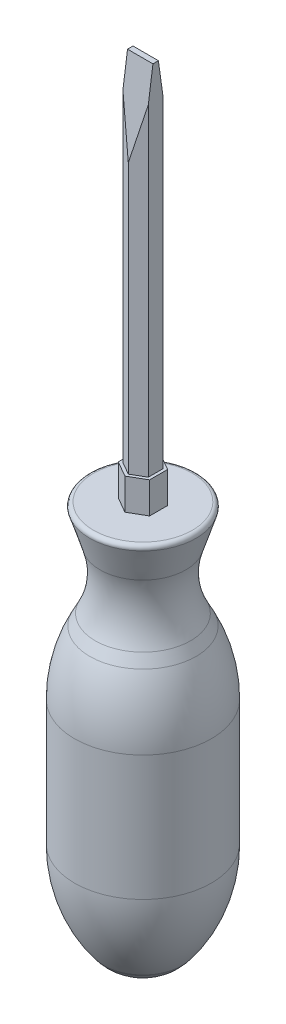
ISO-10303-21;
HEADER;
FILE_DESCRIPTION(('STEP AP214'),'2;1');
FILE_NAME('part.step','',(''),(''),'','','');
FILE_SCHEMA(('AUTOMOTIVE_DESIGN { 1 0 10303 214 1 1 1 1 }'));
ENDSEC;
DATA;
#1=APPLICATION_CONTEXT('core data for automotive mechanical design processes');
#2=APPLICATION_PROTOCOL_DEFINITION('international standard','automotive_design',2000,#1);
#3=PRODUCT_CONTEXT('',#1,'mechanical');
#4=PRODUCT('Part','Part','',(#3));
#5=PRODUCT_RELATED_PRODUCT_CATEGORY('part','',(#4));
#6=PRODUCT_DEFINITION_FORMATION('','',#4);
#7=PRODUCT_DEFINITION_CONTEXT('part definition',#1,'design');
#8=PRODUCT_DEFINITION('design','',#6,#7);
#9=PRODUCT_DEFINITION_SHAPE('','',#8);
#10=(LENGTH_UNIT() NAMED_UNIT(*) SI_UNIT(.MILLI.,.METRE.));
#11=(NAMED_UNIT(*) PLANE_ANGLE_UNIT() SI_UNIT($,.RADIAN.));
#12=(NAMED_UNIT(*) SI_UNIT($,.STERADIAN.) SOLID_ANGLE_UNIT());
#13=UNCERTAINTY_MEASURE_WITH_UNIT(LENGTH_MEASURE(1.E-05),#10,'distance_accuracy_value','');
#14=(GEOMETRIC_REPRESENTATION_CONTEXT(3) GLOBAL_UNCERTAINTY_ASSIGNED_CONTEXT((#13)) GLOBAL_UNIT_ASSIGNED_CONTEXT((#10,
#11,#12)) REPRESENTATION_CONTEXT('',''));
#15=CARTESIAN_POINT('',(0.,0.,0.));
#16=DIRECTION('',(0.,0.,1.));
#17=DIRECTION('',(1.,0.,0.));
#18=AXIS2_PLACEMENT_3D('',#15,#16,#17);
#19=CARTESIAN_POINT('',(-3.25,99.,-1.87638837486629));
#20=DIRECTION('',(1.,0.,0.));
#21=DIRECTION('',(0.,0.,-1.));
#22=AXIS2_PLACEMENT_3D('',#19,#20,#21);
#23=PLANE('',#22);
#24=DIRECTION('',(0.,-0.99050931319309,0.137445627350429));
#25=VECTOR('',#24,1.);
#26=CARTESIAN_POINT('',(-3.25,99.350752537901,0.65132867306301));
#27=LINE('',#26,#25);
#28=CARTESIAN_POINT('',(-3.25,99.,0.699999999999999));
#29=VERTEX_POINT('',#28);
#30=CARTESIAN_POINT('',(-3.25,90.5222938430314,1.87638837486628));
#31=VERTEX_POINT('',#30);
#32=EDGE_CURVE('E140',#29,#31,#27,.T.);
#33=ORIENTED_EDGE('',*,*,#32,.F.);
#34=DIRECTION('',(0.,0.,1.));
#35=VECTOR('',#34,1.);
#36=CARTESIAN_POINT('',(-3.25,99.,-1.87638837486629));
#37=LINE('',#36,#35);
#38=CARTESIAN_POINT('',(-3.25,99.,-0.700000000000001));
#39=VERTEX_POINT('',#38);
#40=EDGE_CURVE('E257',#39,#29,#37,.T.);
#41=ORIENTED_EDGE('',*,*,#40,.F.);
#42=DIRECTION('',(0.,-0.99050931319309,-0.137445627350429));
#43=VECTOR('',#42,1.);
#44=CARTESIAN_POINT('',(-3.25,98.8398451056266,-0.722223506268136));
#45=LINE('',#44,#43);
#46=CARTESIAN_POINT('',(-3.25,90.5222938430314,-1.87638837486629));
#47=VERTEX_POINT('',#46);
#48=EDGE_CURVE('E58',#39,#47,#45,.T.);
#49=ORIENTED_EDGE('',*,*,#48,.T.);
#50=DIRECTION('',(0.,-1.,0.));
#51=VECTOR('',#50,1.);
#52=CARTESIAN_POINT('',(-3.25,99.,-1.87638837486629));
#53=LINE('',#52,#51);
#54=CARTESIAN_POINT('',(-3.25,8.,-1.87638837486629));
#55=VERTEX_POINT('',#54);
#56=EDGE_CURVE('E261',#47,#55,#53,.T.);
#57=ORIENTED_EDGE('',*,*,#56,.T.);
#58=DIRECTION('',(0.,0.,1.));
#59=VECTOR('',#58,1.);
#60=CARTESIAN_POINT('',(-3.25,8.,-1.87638837486629));
#61=LINE('',#60,#59);
#62=CARTESIAN_POINT('',(-3.25,8.,1.87638837486628));
#63=VERTEX_POINT('',#62);
#64=EDGE_CURVE('E251',#55,#63,#61,.T.);
#65=ORIENTED_EDGE('',*,*,#64,.T.);
#66=DIRECTION('',(0.,-1.,0.));
#67=VECTOR('',#66,1.);
#68=CARTESIAN_POINT('',(-3.25,99.,1.87638837486628));
#69=LINE('',#68,#67);
#70=EDGE_CURVE('E157',#31,#63,#69,.T.);
#71=ORIENTED_EDGE('',*,*,#70,.F.);
#72=EDGE_LOOP('',(#33,#41,#49,#57,#65,#71));
#73=FACE_BOUND('',#72,.T.);
#74=ADVANCED_FACE('F36',(#73),#23,.F.);
#75=CARTESIAN_POINT('',(-3.25,99.,1.87638837486628));
#76=DIRECTION('',(0.5,0.,-0.866025403784438));
#77=DIRECTION('',(-0.866025403784439,0.,-0.5));
#78=AXIS2_PLACEMENT_3D('',#75,#76,#77);
#79=PLANE('',#78);
#80=DIRECTION('',(0.231590672982891,-0.963580655809246,0.133708937388479));
#81=VECTOR('',#80,1.);
#82=CARTESIAN_POINT('',(-5.14185347533571,98.3937395665544,0.784126261613883));
#83=LINE('',#82,#81);
#84=CARTESIAN_POINT('',(0.,77.,3.75277674973257));
#85=VERTEX_POINT('',#84);
#86=EDGE_CURVE('E135',#31,#85,#83,.T.);
#87=ORIENTED_EDGE('',*,*,#86,.F.);
#88=ORIENTED_EDGE('',*,*,#70,.T.);
#89=DIRECTION('',(0.866025403784438,0.,0.5));
#90=VECTOR('',#89,1.);
#91=CARTESIAN_POINT('',(-3.25,8.,1.87638837486628));
#92=LINE('',#91,#90);
#93=CARTESIAN_POINT('',(0.,8.,3.75277674973257));
#94=VERTEX_POINT('',#93);
#95=EDGE_CURVE('E155',#63,#94,#92,.T.);
#96=ORIENTED_EDGE('',*,*,#95,.T.);
#97=DIRECTION('',(0.,-1.,0.));
#98=VECTOR('',#97,1.);
#99=CARTESIAN_POINT('',(0.,99.,3.75277674973257));
#100=LINE('',#99,#98);
#101=EDGE_CURVE('E149',#85,#94,#100,.T.);
#102=ORIENTED_EDGE('',*,*,#101,.F.);
#103=EDGE_LOOP('',(#87,#88,#96,#102));
#104=FACE_BOUND('',#103,.T.);
#105=ADVANCED_FACE('F153',(#104),#79,.F.);
#106=CARTESIAN_POINT('',(0.,99.,3.75277674973257));
#107=DIRECTION('',(-0.5,0.,-0.866025403784439));
#108=DIRECTION('',(-0.866025403784439,0.,0.5));
#109=AXIS2_PLACEMENT_3D('',#106,#107,#108);
#110=PLANE('',#109);
#111=DIRECTION('',(0.231590672982891,0.963580655809245,-0.133708937388479));
#112=VECTOR('',#111,1.);
#113=CARTESIAN_POINT('',(4.90943843614749,97.4267289654951,0.918311147052926));
#114=LINE('',#113,#112);
#115=CARTESIAN_POINT('',(3.25,90.5222938430314,1.87638837486629));
#116=VERTEX_POINT('',#115);
#117=EDGE_CURVE('E138',#85,#116,#114,.T.);
#118=ORIENTED_EDGE('',*,*,#117,.F.);
#119=ORIENTED_EDGE('',*,*,#101,.T.);
#120=DIRECTION('',(0.866025403784439,0.,-0.5));
#121=VECTOR('',#120,1.);
#122=CARTESIAN_POINT('',(0.,8.,3.75277674973257));
#123=LINE('',#122,#121);
#124=CARTESIAN_POINT('',(3.25,8.,1.87638837486629));
#125=VERTEX_POINT('',#124);
#126=EDGE_CURVE('E265',#94,#125,#123,.T.);
#127=ORIENTED_EDGE('',*,*,#126,.T.);
#128=DIRECTION('',(0.,-1.,0.));
#129=VECTOR('',#128,1.);
#130=CARTESIAN_POINT('',(3.25,99.,1.87638837486629));
#131=LINE('',#130,#129);
#132=EDGE_CURVE('E151',#116,#125,#131,.T.);
#133=ORIENTED_EDGE('',*,*,#132,.F.);
#134=EDGE_LOOP('',(#118,#119,#127,#133));
#135=FACE_BOUND('',#134,.T.);
#136=ADVANCED_FACE('F147',(#135),#110,.F.);
#137=CARTESIAN_POINT('',(3.25,99.,1.87638837486629));
#138=DIRECTION('',(-1.,0.,0.));
#139=DIRECTION('',(0.,0.,1.));
#140=AXIS2_PLACEMENT_3D('',#137,#138,#139);
#141=PLANE('',#140);
#142=DIRECTION('',(0.,0.99050931319309,-0.137445627350429));
#143=VECTOR('',#142,1.);
#144=CARTESIAN_POINT('',(3.25,98.8398451056266,0.722223506268134));
#145=LINE('',#144,#143);
#146=CARTESIAN_POINT('',(3.25,99.,0.699999999999999));
#147=VERTEX_POINT('',#146);
#148=EDGE_CURVE('E51',#116,#147,#145,.T.);
#149=ORIENTED_EDGE('',*,*,#148,.F.);
#150=ORIENTED_EDGE('',*,*,#132,.T.);
#151=DIRECTION('',(0.,0.,-1.));
#152=VECTOR('',#151,1.);
#153=CARTESIAN_POINT('',(3.25,8.,1.87638837486629));
#154=LINE('',#153,#152);
#155=CARTESIAN_POINT('',(3.25,8.,-1.87638837486628));
#156=VERTEX_POINT('',#155);
#157=EDGE_CURVE('E267',#125,#156,#154,.T.);
#158=ORIENTED_EDGE('',*,*,#157,.T.);
#159=DIRECTION('',(0.,-1.,0.));
#160=VECTOR('',#159,1.);
#161=CARTESIAN_POINT('',(3.25,99.,-1.87638837486628));
#162=LINE('',#161,#160);
#163=CARTESIAN_POINT('',(3.25,90.5222938430315,-1.87638837486628));
#164=VERTEX_POINT('',#163);
#165=EDGE_CURVE('E161',#164,#156,#162,.T.);
#166=ORIENTED_EDGE('',*,*,#165,.F.);
#167=DIRECTION('',(0.,0.99050931319309,0.137445627350429));
#168=VECTOR('',#167,1.);
#169=CARTESIAN_POINT('',(3.25,99.350752537901,-0.651328673063012));
#170=LINE('',#169,#168);
#171=CARTESIAN_POINT('',(3.25,99.,-0.700000000000001));
#172=VERTEX_POINT('',#171);
#173=EDGE_CURVE('E238',#164,#172,#170,.T.);
#174=ORIENTED_EDGE('',*,*,#173,.T.);
#175=DIRECTION('',(0.,0.,-1.));
#176=VECTOR('',#175,1.);
#177=CARTESIAN_POINT('',(3.25,99.,1.87638837486629));
#178=LINE('',#177,#176);
#179=EDGE_CURVE('E247',#147,#172,#178,.T.);
#180=ORIENTED_EDGE('',*,*,#179,.F.);
#181=EDGE_LOOP('',(#149,#150,#158,#166,#174,#180));
#182=FACE_BOUND('',#181,.T.);
#183=ADVANCED_FACE('F246',(#182),#141,.F.);
#184=CARTESIAN_POINT('',(0.,99.,0.));
#185=DIRECTION('',(0.,1.,0.));
#186=DIRECTION('',(0.,0.,1.));
#187=AXIS2_PLACEMENT_3D('',#184,#185,#186);
#188=PLANE('',#187);
#189=ORIENTED_EDGE('',*,*,#40,.T.);
#190=DIRECTION('',(1.,0.,0.));
#191=VECTOR('',#190,1.);
#192=CARTESIAN_POINT('',(0.,99.,0.699999999999999));
#193=LINE('',#192,#191);
#194=EDGE_CURVE('E11',#29,#147,#193,.T.);
#195=ORIENTED_EDGE('',*,*,#194,.T.);
#196=ORIENTED_EDGE('',*,*,#179,.T.);
#197=DIRECTION('',(1.,0.,0.));
#198=VECTOR('',#197,1.);
#199=CARTESIAN_POINT('',(0.,99.,-0.700000000000001));
#200=LINE('',#199,#198);
#201=EDGE_CURVE('E44',#39,#172,#200,.T.);
#202=ORIENTED_EDGE('',*,*,#201,.F.);
#203=EDGE_LOOP('',(#189,#195,#196,#202));
#204=FACE_BOUND('',#203,.T.);
#205=ADVANCED_FACE('F292',(#204),#188,.T.);
#206=CARTESIAN_POINT('',(0.,8.,0.));
#207=DIRECTION('',(0.,1.,0.));
#208=DIRECTION('',(0.,0.,1.));
#209=AXIS2_PLACEMENT_3D('',#206,#207,#208);
#210=PLANE('',#209);
#211=DIRECTION('',(0.,0.,1.));
#212=VECTOR('',#211,1.);
#213=CARTESIAN_POINT('',(-4.,8.,-2.30940107675851));
#214=LINE('',#213,#212);
#215=CARTESIAN_POINT('',(-4.,8.,-2.30940107675851));
#216=VERTEX_POINT('',#215);
#217=CARTESIAN_POINT('',(-4.,8.,2.3094010767585));
#218=VERTEX_POINT('',#217);
#219=EDGE_CURVE('E165',#216,#218,#214,.T.);
#220=ORIENTED_EDGE('',*,*,#219,.T.);
#221=DIRECTION('',(0.866025403784438,0.,0.5));
#222=VECTOR('',#221,1.);
#223=CARTESIAN_POINT('',(-4.,8.,2.3094010767585));
#224=LINE('',#223,#222);
#225=CARTESIAN_POINT('',(0.,8.,4.61880215351701));
#226=VERTEX_POINT('',#225);
#227=EDGE_CURVE('E168',#218,#226,#224,.T.);
#228=ORIENTED_EDGE('',*,*,#227,.T.);
#229=DIRECTION('',(0.866025403784439,0.,-0.499999999999999));
#230=VECTOR('',#229,1.);
#231=CARTESIAN_POINT('',(0.,8.,4.61880215351701));
#232=LINE('',#231,#230);
#233=CARTESIAN_POINT('',(4.,8.,2.30940107675851));
#234=VERTEX_POINT('',#233);
#235=EDGE_CURVE('E171',#226,#234,#232,.T.);
#236=ORIENTED_EDGE('',*,*,#235,.T.);
#237=DIRECTION('',(0.,0.,-1.));
#238=VECTOR('',#237,1.);
#239=CARTESIAN_POINT('',(4.,8.,2.30940107675851));
#240=LINE('',#239,#238);
#241=CARTESIAN_POINT('',(4.,8.,-2.3094010767585));
#242=VERTEX_POINT('',#241);
#243=EDGE_CURVE('E173',#234,#242,#240,.T.);
#244=ORIENTED_EDGE('',*,*,#243,.T.);
#245=DIRECTION('',(-0.866025403784438,0.,-0.5));
#246=VECTOR('',#245,1.);
#247=CARTESIAN_POINT('',(4.,8.,-2.3094010767585));
#248=LINE('',#247,#246);
#249=CARTESIAN_POINT('',(0.,8.,-4.61880215351701));
#250=VERTEX_POINT('',#249);
#251=EDGE_CURVE('E175',#242,#250,#248,.T.);
#252=ORIENTED_EDGE('',*,*,#251,.T.);
#253=DIRECTION('',(-0.866025403784439,0.,0.499999999999999));
#254=VECTOR('',#253,1.);
#255=CARTESIAN_POINT('',(0.,8.,-4.61880215351701));
#256=LINE('',#255,#254);
#257=EDGE_CURVE('E177',#250,#216,#256,.T.);
#258=ORIENTED_EDGE('',*,*,#257,.T.);
#259=EDGE_LOOP('',(#220,#228,#236,#244,#252,#258));
#260=FACE_BOUND('',#259,.T.);
#261=ORIENTED_EDGE('',*,*,#95,.F.);
#262=ORIENTED_EDGE('',*,*,#64,.F.);
#263=DIRECTION('',(-0.866025403784439,0.,0.5));
#264=VECTOR('',#263,1.);
#265=CARTESIAN_POINT('',(0.,8.,-3.75277674973257));
#266=LINE('',#265,#264);
#267=CARTESIAN_POINT('',(0.,8.,-3.75277674973257));
#268=VERTEX_POINT('',#267);
#269=EDGE_CURVE('E259',#268,#55,#266,.T.);
#270=ORIENTED_EDGE('',*,*,#269,.F.);
#271=DIRECTION('',(-0.866025403784438,0.,-0.5));
#272=VECTOR('',#271,1.);
#273=CARTESIAN_POINT('',(3.25,8.,-1.87638837486628));
#274=LINE('',#273,#272);
#275=EDGE_CURVE('E269',#156,#268,#274,.T.);
#276=ORIENTED_EDGE('',*,*,#275,.F.);
#277=ORIENTED_EDGE('',*,*,#157,.F.);
#278=ORIENTED_EDGE('',*,*,#126,.F.);
#279=EDGE_LOOP('',(#261,#262,#270,#276,#277,#278));
#280=FACE_BOUND('',#279,.T.);
#281=ADVANCED_FACE('F283',(#260,#280),#210,.T.);
#282=CARTESIAN_POINT('',(-12.6496969405464,0.,0.));
#283=DIRECTION('',(0.,1.,0.));
#284=DIRECTION('',(0.,0.,1.));
#285=AXIS2_PLACEMENT_3D('',#282,#283,#284);
#286=PLANE('',#285);
#287=CARTESIAN_POINT('',(0.,0.,0.));
#288=DIRECTION('',(0.,1.,0.));
#289=DIRECTION('',(0.,0.,1.));
#290=AXIS2_PLACEMENT_3D('',#287,#288,#289);
#291=CIRCLE('',#290,12.6496969405464);
#292=CARTESIAN_POINT('',(0.,0.,12.6496969405464));
#293=VERTEX_POINT('',#292);
#294=EDGE_CURVE('E231',#293,#293,#291,.T.);
#295=ORIENTED_EDGE('',*,*,#294,.T.);
#296=EDGE_LOOP('',(#295));
#297=FACE_BOUND('',#296,.T.);
#298=DIRECTION('',(0.866025403784438,0.,0.5));
#299=VECTOR('',#298,1.);
#300=CARTESIAN_POINT('',(-4.,0.,2.3094010767585));
#301=LINE('',#300,#299);
#302=CARTESIAN_POINT('',(-4.,0.,2.3094010767585));
#303=VERTEX_POINT('',#302);
#304=CARTESIAN_POINT('',(0.,0.,4.61880215351701));
#305=VERTEX_POINT('',#304);
#306=EDGE_CURVE('E182',#303,#305,#301,.T.);
#307=ORIENTED_EDGE('',*,*,#306,.F.);
#308=DIRECTION('',(0.,0.,1.));
#309=VECTOR('',#308,1.);
#310=CARTESIAN_POINT('',(-4.,0.,-2.30940107675851));
#311=LINE('',#310,#309);
#312=CARTESIAN_POINT('',(-4.,0.,-2.30940107675851));
#313=VERTEX_POINT('',#312);
#314=EDGE_CURVE('E159',#313,#303,#311,.T.);
#315=ORIENTED_EDGE('',*,*,#314,.F.);
#316=DIRECTION('',(-0.866025403784439,0.,0.499999999999999));
#317=VECTOR('',#316,1.);
#318=CARTESIAN_POINT('',(0.,0.,-4.61880215351701));
#319=LINE('',#318,#317);
#320=CARTESIAN_POINT('',(0.,0.,-4.61880215351701));
#321=VERTEX_POINT('',#320);
#322=EDGE_CURVE('E169',#321,#313,#319,.T.);
#323=ORIENTED_EDGE('',*,*,#322,.F.);
#324=DIRECTION('',(-0.866025403784438,0.,-0.5));
#325=VECTOR('',#324,1.);
#326=CARTESIAN_POINT('',(4.,0.,-2.3094010767585));
#327=LINE('',#326,#325);
#328=CARTESIAN_POINT('',(4.,0.,-2.3094010767585));
#329=VERTEX_POINT('',#328);
#330=EDGE_CURVE('E188',#329,#321,#327,.T.);
#331=ORIENTED_EDGE('',*,*,#330,.F.);
#332=DIRECTION('',(0.,0.,-1.));
#333=VECTOR('',#332,1.);
#334=CARTESIAN_POINT('',(4.,0.,2.30940107675851));
#335=LINE('',#334,#333);
#336=CARTESIAN_POINT('',(4.,0.,2.30940107675851));
#337=VERTEX_POINT('',#336);
#338=EDGE_CURVE('E186',#337,#329,#335,.T.);
#339=ORIENTED_EDGE('',*,*,#338,.F.);
#340=DIRECTION('',(0.866025403784439,0.,-0.499999999999999));
#341=VECTOR('',#340,1.);
#342=CARTESIAN_POINT('',(0.,0.,4.61880215351701));
#343=LINE('',#342,#341);
#344=EDGE_CURVE('E184',#305,#337,#343,.T.);
#345=ORIENTED_EDGE('',*,*,#344,.F.);
#346=EDGE_LOOP('',(#307,#315,#323,#331,#339,#345));
#347=FACE_BOUND('',#346,.T.);
#348=ADVANCED_FACE('F299',(#297,#347),#286,.T.);
#349=CARTESIAN_POINT('',(0.,-92.,0.));
#350=DIRECTION('',(0.,1.,0.));
#351=DIRECTION('',(0.,0.,1.));
#352=AXIS2_PLACEMENT_3D('',#349,#350,#351);
#353=DEGENERATE_TOROIDAL_SURFACE('',#352,1.80659044005612,10.,.T.);
#354=CARTESIAN_POINT('',(0.,-102.,0.));
#355=DIRECTION('',(0.,1.,0.));
#356=DIRECTION('',(0.,0.,1.));
#357=AXIS2_PLACEMENT_3D('',#354,#355,#356);
#358=CIRCLE('',#357,1.80659044005612);
#359=CARTESIAN_POINT('',(0.,-102.,1.80659044005612));
#360=VERTEX_POINT('',#359);
#361=EDGE_CURVE('E234',#360,#360,#358,.T.);
#362=ORIENTED_EDGE('',*,*,#361,.T.);
#363=EDGE_LOOP('',(#362));
#364=FACE_BOUND('',#363,.T.);
#365=CARTESIAN_POINT('',(0.,-98.1339305177818,0.));
#366=DIRECTION('',(0.,1.,0.));
#367=DIRECTION('',(0.,0.,1.));
#368=AXIS2_PLACEMENT_3D('',#365,#366,#367);
#369=CIRCLE('',#368,9.70436838090914);
#370=CARTESIAN_POINT('',(0.,-98.1339305177818,9.70436838090914));
#371=VERTEX_POINT('',#370);
#372=EDGE_CURVE('E207',#371,#371,#369,.T.);
#373=ORIENTED_EDGE('',*,*,#372,.F.);
#374=EDGE_LOOP('',(#373));
#375=FACE_BOUND('',#374,.T.);
#376=ADVANCED_FACE('F38',(#364,#375),#353,.T.);
#377=CARTESIAN_POINT('',(-1.80659044005612,-102.,0.));
#378=DIRECTION('',(0.,-1.,0.));
#379=DIRECTION('',(0.,0.,-1.));
#380=AXIS2_PLACEMENT_3D('',#377,#378,#379);
#381=PLANE('',#380);
#382=ORIENTED_EDGE('',*,*,#361,.F.);
#383=EDGE_LOOP('',(#382));
#384=FACE_BOUND('',#383,.T.);
#385=ADVANCED_FACE('F368',(#384),#381,.T.);
#386=CARTESIAN_POINT('',(0.,-1.,0.));
#387=DIRECTION('',(0.,1.,0.));
#388=DIRECTION('',(0.,0.,1.));
#389=AXIS2_PLACEMENT_3D('',#386,#387,#388);
#390=TOROIDAL_SURFACE('',#389,12.6496969405464,1.);
#391=CARTESIAN_POINT('',(0.,-1.30201949241902,0.));
#392=DIRECTION('',(0.,1.,0.));
#393=DIRECTION('',(0.,0.,1.));
#394=AXIS2_PLACEMENT_3D('',#391,#392,#393);
#395=CIRCLE('',#394,13.6029986903607);
#396=CARTESIAN_POINT('',(0.,-1.30201949241902,13.6029986903607));
#397=VERTEX_POINT('',#396);
#398=EDGE_CURVE('E228',#397,#397,#395,.T.);
#399=ORIENTED_EDGE('',*,*,#398,.T.);
#400=EDGE_LOOP('',(#399));
#401=FACE_BOUND('',#400,.T.);
#402=ORIENTED_EDGE('',*,*,#294,.F.);
#403=EDGE_LOOP('',(#402));
#404=FACE_BOUND('',#403,.T.);
#405=ADVANCED_FACE('F364',(#401,#404),#390,.T.);
#406=CARTESIAN_POINT('',(0.,-1.30201949241902,0.));
#407=DIRECTION('',(0.,1.,0.));
#408=DIRECTION('',(0.,0.,1.));
#409=AXIS2_PLACEMENT_3D('',#406,#407,#408);
#410=CONICAL_SURFACE('',#409,13.6029986903607,0.306810364064564);
#411=CARTESIAN_POINT('',(0.,-9.62037889169504,0.));
#412=DIRECTION('',(0.,1.,0.));
#413=DIRECTION('',(0.,0.,1.));
#414=AXIS2_PLACEMENT_3D('',#411,#412,#413);
#415=CIRCLE('',#414,10.9676246505901);
#416=CARTESIAN_POINT('',(0.,-9.62037889169504,10.9676246505901));
#417=VERTEX_POINT('',#416);
#418=EDGE_CURVE('E225',#417,#417,#415,.T.);
#419=ORIENTED_EDGE('',*,*,#418,.T.);
#420=EDGE_LOOP('',(#419));
#421=FACE_BOUND('',#420,.T.);
#422=ORIENTED_EDGE('',*,*,#398,.F.);
#423=EDGE_LOOP('',(#422));
#424=FACE_BOUND('',#423,.T.);
#425=ADVANCED_FACE('F360',(#421,#424),#410,.T.);
#426=CARTESIAN_POINT('',(0.,-15.6607687400758,0.));
#427=DIRECTION('',(0.,1.,0.));
#428=DIRECTION('',(0.,0.,1.));
#429=AXIS2_PLACEMENT_3D('',#426,#427,#428);
#430=TOROIDAL_SURFACE('',#429,30.0336596468754,20.);
#431=CARTESIAN_POINT('',(0.,-24.7113378355905,0.));
#432=DIRECTION('',(0.,1.,0.));
#433=DIRECTION('',(0.,0.,1.));
#434=AXIS2_PLACEMENT_3D('',#431,#432,#433);
#435=CIRCLE('',#434,12.1986603744529);
#436=CARTESIAN_POINT('',(0.,-24.7113378355905,12.1986603744529));
#437=VERTEX_POINT('',#436);
#438=EDGE_CURVE('E222',#437,#437,#435,.T.);
#439=ORIENTED_EDGE('',*,*,#438,.T.);
#440=EDGE_LOOP('',(#439));
#441=FACE_BOUND('',#440,.T.);
#442=ORIENTED_EDGE('',*,*,#418,.F.);
#443=EDGE_LOOP('',(#442));
#444=FACE_BOUND('',#443,.T.);
#445=ADVANCED_FACE('F356',(#441,#444),#430,.F.);
#446=CARTESIAN_POINT('',(0.,-24.7113378355905,0.));
#447=DIRECTION('',(0.,-1.,0.));
#448=DIRECTION('',(0.,0.,-1.));
#449=AXIS2_PLACEMENT_3D('',#446,#447,#448);
#450=CONICAL_SURFACE('',#449,12.1986603744529,0.469598691262018);
#451=CARTESIAN_POINT('',(0.,-27.4787188232526,0.));
#452=DIRECTION('',(0.,1.,0.));
#453=DIRECTION('',(0.,0.,1.));
#454=AXIS2_PLACEMENT_3D('',#451,#452,#453);
#455=CIRCLE('',#454,13.6029986903606);
#456=CARTESIAN_POINT('',(0.,-27.4787188232526,13.6029986903606));
#457=VERTEX_POINT('',#456);
#458=EDGE_CURVE('E219',#457,#457,#455,.T.);
#459=ORIENTED_EDGE('',*,*,#458,.T.);
#460=EDGE_LOOP('',(#459));
#461=FACE_BOUND('',#460,.T.);
#462=ORIENTED_EDGE('',*,*,#438,.F.);
#463=EDGE_LOOP('',(#462));
#464=FACE_BOUND('',#463,.T.);
#465=ADVANCED_FACE('F352',(#461,#464),#450,.T.);
#466=CARTESIAN_POINT('',(0.,-43.7697431951792,0.));
#467=DIRECTION('',(0.,1.,0.));
#468=DIRECTION('',(0.,0.,1.));
#469=AXIS2_PLACEMENT_3D('',#466,#467,#468);
#470=DEGENERATE_TOROIDAL_SURFACE('',#469,18.5,36.,.F.);
#471=CARTESIAN_POINT('',(0.,-43.7697431951792,0.));
#472=DIRECTION('',(0.,1.,0.));
#473=DIRECTION('',(0.,0.,1.));
#474=AXIS2_PLACEMENT_3D('',#471,#472,#473);
#475=CIRCLE('',#474,17.5);
#476=CARTESIAN_POINT('',(0.,-43.7697431951792,17.5));
#477=VERTEX_POINT('',#476);
#478=EDGE_CURVE('E216',#477,#477,#475,.T.);
#479=ORIENTED_EDGE('',*,*,#478,.T.);
#480=EDGE_LOOP('',(#479));
#481=FACE_BOUND('',#480,.T.);
#482=ORIENTED_EDGE('',*,*,#458,.F.);
#483=EDGE_LOOP('',(#482));
#484=FACE_BOUND('',#483,.T.);
#485=ADVANCED_FACE('F348',(#481,#484),#470,.F.);
#486=CARTESIAN_POINT('',(0.,79.6261522890065,0.));
#487=DIRECTION('',(0.,1.,0.));
#488=DIRECTION('',(0.,0.,1.));
#489=AXIS2_PLACEMENT_3D('',#486,#487,#488);
#490=CYLINDRICAL_SURFACE('',#489,17.5);
#491=CARTESIAN_POINT('',(0.,-75.7586914817852,0.));
#492=DIRECTION('',(0.,1.,0.));
#493=DIRECTION('',(0.,0.,1.));
#494=AXIS2_PLACEMENT_3D('',#491,#492,#493);
#495=CIRCLE('',#494,17.5);
#496=CARTESIAN_POINT('',(0.,-75.7586914817852,17.5));
#497=VERTEX_POINT('',#496);
#498=EDGE_CURVE('E213',#497,#497,#495,.T.);
#499=ORIENTED_EDGE('',*,*,#498,.T.);
#500=EDGE_LOOP('',(#499));
#501=FACE_BOUND('',#500,.T.);
#502=ORIENTED_EDGE('',*,*,#478,.F.);
#503=EDGE_LOOP('',(#502));
#504=FACE_BOUND('',#503,.T.);
#505=ADVANCED_FACE('F344',(#501,#504),#490,.T.);
#506=CARTESIAN_POINT('',(0.,-75.7586914817852,0.));
#507=DIRECTION('',(0.,1.,0.));
#508=DIRECTION('',(0.,0.,1.));
#509=AXIS2_PLACEMENT_3D('',#506,#507,#508);
#510=DEGENERATE_TOROIDAL_SURFACE('',#509,18.5,36.,.F.);
#511=CARTESIAN_POINT('',(0.,-97.8408413457998,0.));
#512=DIRECTION('',(0.,1.,0.));
#513=DIRECTION('',(0.,0.,1.));
#514=AXIS2_PLACEMENT_3D('',#511,#512,#513);
#515=CIRCLE('',#514,9.93200058707086);
#516=CARTESIAN_POINT('',(0.,-97.8408413457998,9.93200058707086));
#517=VERTEX_POINT('',#516);
#518=EDGE_CURVE('E210',#517,#517,#515,.T.);
#519=ORIENTED_EDGE('',*,*,#518,.T.);
#520=EDGE_LOOP('',(#519));
#521=FACE_BOUND('',#520,.T.);
#522=ORIENTED_EDGE('',*,*,#498,.F.);
#523=EDGE_LOOP('',(#522));
#524=FACE_BOUND('',#523,.T.);
#525=ADVANCED_FACE('F340',(#521,#524),#510,.F.);
#526=CARTESIAN_POINT('',(0.,-97.8408413457998,0.));
#527=DIRECTION('',(0.,1.,0.));
#528=DIRECTION('',(0.,0.,1.));
#529=AXIS2_PLACEMENT_3D('',#526,#527,#528);
#530=CONICAL_SURFACE('',#529,9.93200058707086,0.660349670898123);
#531=ORIENTED_EDGE('',*,*,#372,.T.);
#532=EDGE_LOOP('',(#531));
#533=FACE_BOUND('',#532,.T.);
#534=ORIENTED_EDGE('',*,*,#518,.F.);
#535=EDGE_LOOP('',(#534));
#536=FACE_BOUND('',#535,.T.);
#537=ADVANCED_FACE('F336',(#533,#536),#530,.T.);
#538=CARTESIAN_POINT('',(-4.,8.,-2.30940107675851));
#539=DIRECTION('',(1.,0.,0.));
#540=DIRECTION('',(0.,0.,-1.));
#541=AXIS2_PLACEMENT_3D('',#538,#539,#540);
#542=PLANE('',#541);
#543=ORIENTED_EDGE('',*,*,#314,.T.);
#544=DIRECTION('',(0.,-1.,0.));
#545=VECTOR('',#544,1.);
#546=CARTESIAN_POINT('',(-4.,8.,2.3094010767585));
#547=LINE('',#546,#545);
#548=EDGE_CURVE('E205',#218,#303,#547,.T.);
#549=ORIENTED_EDGE('',*,*,#548,.F.);
#550=ORIENTED_EDGE('',*,*,#219,.F.);
#551=DIRECTION('',(0.,-1.,0.));
#552=VECTOR('',#551,1.);
#553=CARTESIAN_POINT('',(-4.,8.,-2.30940107675851));
#554=LINE('',#553,#552);
#555=EDGE_CURVE('E179',#216,#313,#554,.T.);
#556=ORIENTED_EDGE('',*,*,#555,.T.);
#557=EDGE_LOOP('',(#543,#549,#550,#556));
#558=FACE_BOUND('',#557,.T.);
#559=ADVANCED_FACE('F332',(#558),#542,.F.);
#560=CARTESIAN_POINT('',(-4.,8.,2.3094010767585));
#561=DIRECTION('',(0.5,0.,-0.866025403784438));
#562=DIRECTION('',(-0.866025403784438,0.,-0.5));
#563=AXIS2_PLACEMENT_3D('',#560,#561,#562);
#564=PLANE('',#563);
#565=ORIENTED_EDGE('',*,*,#306,.T.);
#566=DIRECTION('',(0.,-1.,0.));
#567=VECTOR('',#566,1.);
#568=CARTESIAN_POINT('',(0.,8.,4.61880215351701));
#569=LINE('',#568,#567);
#570=EDGE_CURVE('E202',#226,#305,#569,.T.);
#571=ORIENTED_EDGE('',*,*,#570,.F.);
#572=ORIENTED_EDGE('',*,*,#227,.F.);
#573=ORIENTED_EDGE('',*,*,#548,.T.);
#574=EDGE_LOOP('',(#565,#571,#572,#573));
#575=FACE_BOUND('',#574,.T.);
#576=ADVANCED_FACE('F328',(#575),#564,.F.);
#577=CARTESIAN_POINT('',(0.,8.,4.61880215351701));
#578=DIRECTION('',(-0.499999999999999,0.,-0.866025403784439));
#579=DIRECTION('',(-0.866025403784439,0.,0.5));
#580=AXIS2_PLACEMENT_3D('',#577,#578,#579);
#581=PLANE('',#580);
#582=ORIENTED_EDGE('',*,*,#344,.T.);
#583=DIRECTION('',(0.,-1.,0.));
#584=VECTOR('',#583,1.);
#585=CARTESIAN_POINT('',(4.,8.,2.30940107675851));
#586=LINE('',#585,#584);
#587=EDGE_CURVE('E199',#234,#337,#586,.T.);
#588=ORIENTED_EDGE('',*,*,#587,.F.);
#589=ORIENTED_EDGE('',*,*,#235,.F.);
#590=ORIENTED_EDGE('',*,*,#570,.T.);
#591=EDGE_LOOP('',(#582,#588,#589,#590));
#592=FACE_BOUND('',#591,.T.);
#593=ADVANCED_FACE('F324',(#592),#581,.F.);
#594=CARTESIAN_POINT('',(4.,8.,2.30940107675851));
#595=DIRECTION('',(-1.,0.,0.));
#596=DIRECTION('',(0.,0.,1.));
#597=AXIS2_PLACEMENT_3D('',#594,#595,#596);
#598=PLANE('',#597);
#599=ORIENTED_EDGE('',*,*,#338,.T.);
#600=DIRECTION('',(0.,-1.,0.));
#601=VECTOR('',#600,1.);
#602=CARTESIAN_POINT('',(4.,8.,-2.3094010767585));
#603=LINE('',#602,#601);
#604=EDGE_CURVE('E196',#242,#329,#603,.T.);
#605=ORIENTED_EDGE('',*,*,#604,.F.);
#606=ORIENTED_EDGE('',*,*,#243,.F.);
#607=ORIENTED_EDGE('',*,*,#587,.T.);
#608=EDGE_LOOP('',(#599,#605,#606,#607));
#609=FACE_BOUND('',#608,.T.);
#610=ADVANCED_FACE('F320',(#609),#598,.F.);
#611=CARTESIAN_POINT('',(4.,8.,-2.3094010767585));
#612=DIRECTION('',(-0.5,0.,0.866025403784438));
#613=DIRECTION('',(0.866025403784438,0.,0.5));
#614=AXIS2_PLACEMENT_3D('',#611,#612,#613);
#615=PLANE('',#614);
#616=ORIENTED_EDGE('',*,*,#330,.T.);
#617=DIRECTION('',(0.,-1.,0.));
#618=VECTOR('',#617,1.);
#619=CARTESIAN_POINT('',(0.,8.,-4.61880215351701));
#620=LINE('',#619,#618);
#621=EDGE_CURVE('E194',#250,#321,#620,.T.);
#622=ORIENTED_EDGE('',*,*,#621,.F.);
#623=ORIENTED_EDGE('',*,*,#251,.F.);
#624=ORIENTED_EDGE('',*,*,#604,.T.);
#625=EDGE_LOOP('',(#616,#622,#623,#624));
#626=FACE_BOUND('',#625,.T.);
#627=ADVANCED_FACE('F316',(#626),#615,.F.);
#628=CARTESIAN_POINT('',(0.,8.,-4.61880215351701));
#629=DIRECTION('',(0.499999999999999,0.,0.866025403784439));
#630=DIRECTION('',(0.866025403784439,0.,-0.499999999999999));
#631=AXIS2_PLACEMENT_3D('',#628,#629,#630);
#632=PLANE('',#631);
#633=ORIENTED_EDGE('',*,*,#322,.T.);
#634=ORIENTED_EDGE('',*,*,#555,.F.);
#635=ORIENTED_EDGE('',*,*,#257,.F.);
#636=ORIENTED_EDGE('',*,*,#621,.T.);
#637=EDGE_LOOP('',(#633,#634,#635,#636));
#638=FACE_BOUND('',#637,.T.);
#639=ADVANCED_FACE('F313',(#638),#632,.F.);
#640=CARTESIAN_POINT('',(3.25,99.,-1.87638837486628));
#641=DIRECTION('',(-0.5,0.,0.866025403784438));
#642=DIRECTION('',(0.866025403784438,0.,0.5));
#643=AXIS2_PLACEMENT_3D('',#640,#641,#642);
#644=PLANE('',#643);
#645=DIRECTION('',(0.,-1.,0.));
#646=VECTOR('',#645,1.);
#647=CARTESIAN_POINT('',(0.,99.,-3.75277674973257));
#648=LINE('',#647,#646);
#649=CARTESIAN_POINT('',(0.,77.,-3.75277674973257));
#650=VERTEX_POINT('',#649);
#651=EDGE_CURVE('E275',#650,#268,#648,.T.);
#652=ORIENTED_EDGE('',*,*,#651,.F.);
#653=DIRECTION('',(0.23159067298289,0.963580655809246,0.133708937388479));
#654=VECTOR('',#653,1.);
#655=CARTESIAN_POINT('',(5.14185347533571,98.3937395665544,-0.784126261613885));
#656=LINE('',#655,#654);
#657=EDGE_CURVE('E249',#650,#164,#656,.T.);
#658=ORIENTED_EDGE('',*,*,#657,.T.);
#659=ORIENTED_EDGE('',*,*,#165,.T.);
#660=ORIENTED_EDGE('',*,*,#275,.T.);
#661=EDGE_LOOP('',(#652,#658,#659,#660));
#662=FACE_BOUND('',#661,.T.);
#663=ADVANCED_FACE('F278',(#662),#644,.F.);
#664=CARTESIAN_POINT('',(0.,99.,-3.75277674973257));
#665=DIRECTION('',(0.5,0.,0.866025403784439));
#666=DIRECTION('',(0.866025403784439,0.,-0.5));
#667=AXIS2_PLACEMENT_3D('',#664,#665,#666);
#668=PLANE('',#667);
#669=ORIENTED_EDGE('',*,*,#56,.F.);
#670=DIRECTION('',(0.231590672982891,-0.963580655809245,-0.133708937388479));
#671=VECTOR('',#670,1.);
#672=CARTESIAN_POINT('',(-4.90943843614748,97.4267289654951,-0.918311147052927));
#673=LINE('',#672,#671);
#674=EDGE_CURVE('E253',#47,#650,#673,.T.);
#675=ORIENTED_EDGE('',*,*,#674,.T.);
#676=ORIENTED_EDGE('',*,*,#651,.T.);
#677=ORIENTED_EDGE('',*,*,#269,.T.);
#678=EDGE_LOOP('',(#669,#675,#676,#677));
#679=FACE_BOUND('',#678,.T.);
#680=ADVANCED_FACE('F287',(#679),#668,.F.);
#681=CARTESIAN_POINT('',(-17.5,99.,-0.700000000000001));
#682=DIRECTION('',(0.,-0.137445627350429,0.99050931319309));
#683=DIRECTION('',(0.,-0.99050931319309,-0.137445627350429));
#684=AXIS2_PLACEMENT_3D('',#681,#682,#683);
#685=PLANE('',#684);
#686=ORIENTED_EDGE('',*,*,#201,.T.);
#687=ORIENTED_EDGE('',*,*,#173,.F.);
#688=ORIENTED_EDGE('',*,*,#657,.F.);
#689=ORIENTED_EDGE('',*,*,#674,.F.);
#690=ORIENTED_EDGE('',*,*,#48,.F.);
#691=EDGE_LOOP('',(#686,#687,#688,#689,#690));
#692=FACE_BOUND('',#691,.T.);
#693=ADVANCED_FACE('F237',(#692),#685,.F.);
#694=CARTESIAN_POINT('',(-17.5,99.,0.699999999999999));
#695=DIRECTION('',(0.,0.137445627350429,0.99050931319309));
#696=DIRECTION('',(0.,-0.99050931319309,0.137445627350429));
#697=AXIS2_PLACEMENT_3D('',#694,#695,#696);
#698=PLANE('',#697);
#699=ORIENTED_EDGE('',*,*,#32,.T.);
#700=ORIENTED_EDGE('',*,*,#86,.T.);
#701=ORIENTED_EDGE('',*,*,#117,.T.);
#702=ORIENTED_EDGE('',*,*,#148,.T.);
#703=ORIENTED_EDGE('',*,*,#194,.F.);
#704=EDGE_LOOP('',(#699,#700,#701,#702,#703));
#705=FACE_BOUND('',#704,.T.);
#706=ADVANCED_FACE('F137',(#705),#698,.T.);
#707=CLOSED_SHELL('',(#74,#105,#136,#183,#205,#281,#348,#376,#385,#405,#425,#445,#465,#485,#505,
#525,#537,#559,#576,#593,#610,#627,#639,#663,#680,#693,#706));
#708=MANIFOLD_SOLID_BREP('B2',#707);
#709=ADVANCED_BREP_SHAPE_REPRESENTATION('',(#18,#708),#14);
#710=SHAPE_DEFINITION_REPRESENTATION(#9,#709);
ENDSEC;
END-ISO-10303-21;
